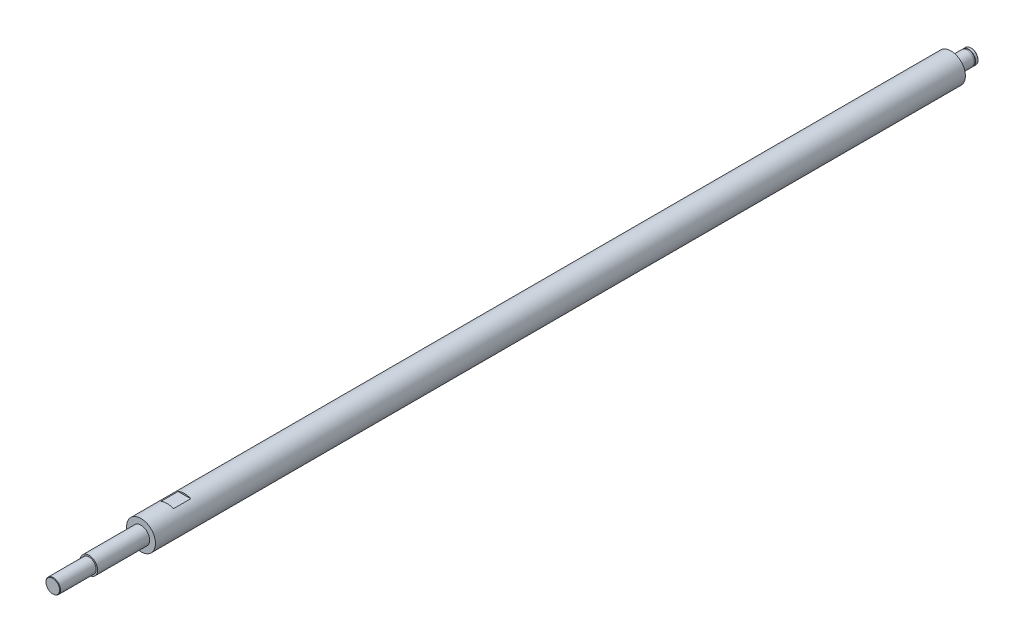
ISO-10303-21;
HEADER;
FILE_DESCRIPTION(('STEP AP214'),'2;1');
FILE_NAME('part.step','',(''),(''),'','','');
FILE_SCHEMA(('AUTOMOTIVE_DESIGN { 1 0 10303 214 1 1 1 1 }'));
ENDSEC;
DATA;
#1=APPLICATION_CONTEXT('core data for automotive mechanical design processes');
#2=APPLICATION_PROTOCOL_DEFINITION('international standard','automotive_design',2000,#1);
#3=PRODUCT_CONTEXT('',#1,'mechanical');
#4=PRODUCT('Part','Part','',(#3));
#5=PRODUCT_RELATED_PRODUCT_CATEGORY('part','',(#4));
#6=PRODUCT_DEFINITION_FORMATION('','',#4);
#7=PRODUCT_DEFINITION_CONTEXT('part definition',#1,'design');
#8=PRODUCT_DEFINITION('design','',#6,#7);
#9=PRODUCT_DEFINITION_SHAPE('','',#8);
#10=(LENGTH_UNIT() NAMED_UNIT(*) SI_UNIT(.MILLI.,.METRE.));
#11=(NAMED_UNIT(*) PLANE_ANGLE_UNIT() SI_UNIT($,.RADIAN.));
#12=(NAMED_UNIT(*) SI_UNIT($,.STERADIAN.) SOLID_ANGLE_UNIT());
#13=UNCERTAINTY_MEASURE_WITH_UNIT(LENGTH_MEASURE(1.E-05),#10,'distance_accuracy_value','');
#14=(GEOMETRIC_REPRESENTATION_CONTEXT(3) GLOBAL_UNCERTAINTY_ASSIGNED_CONTEXT((#13)) GLOBAL_UNIT_ASSIGNED_CONTEXT((#10,
#11,#12)) REPRESENTATION_CONTEXT('',''));
#15=CARTESIAN_POINT('',(0.,0.,0.));
#16=DIRECTION('',(0.,0.,1.));
#17=DIRECTION('',(1.,0.,0.));
#18=AXIS2_PLACEMENT_3D('',#15,#16,#17);
#19=CARTESIAN_POINT('',(0.,0.,610.));
#20=DIRECTION('',(0.,0.,1.));
#21=DIRECTION('',(1.,0.,0.));
#22=AXIS2_PLACEMENT_3D('',#19,#20,#21);
#23=PLANE('',#22);
#24=CARTESIAN_POINT('',(0.,0.,610.));
#25=DIRECTION('',(0.,0.,1.));
#26=DIRECTION('',(1.,0.,0.));
#27=AXIS2_PLACEMENT_3D('',#24,#25,#26);
#28=CIRCLE('',#27,6.);
#29=CARTESIAN_POINT('',(6.,0.,610.));
#30=VERTEX_POINT('',#29);
#31=EDGE_CURVE('E314',#30,#30,#28,.T.);
#32=ORIENTED_EDGE('',*,*,#31,.T.);
#33=EDGE_LOOP('',(#32));
#34=FACE_BOUND('',#33,.T.);
#35=CARTESIAN_POINT('',(0.,0.,610.));
#36=DIRECTION('',(0.,0.,1.));
#37=DIRECTION('',(1.,0.,0.));
#38=AXIS2_PLACEMENT_3D('',#35,#36,#37);
#39=CIRCLE('',#38,5.);
#40=CARTESIAN_POINT('',(5.,0.,610.));
#41=VERTEX_POINT('',#40);
#42=EDGE_CURVE('E310',#41,#41,#39,.T.);
#43=ORIENTED_EDGE('',*,*,#42,.F.);
#44=EDGE_LOOP('',(#43));
#45=FACE_BOUND('',#44,.T.);
#46=ADVANCED_FACE('F17',(#34,#45),#23,.T.);
#47=CARTESIAN_POINT('',(0.,0.,574.));
#48=DIRECTION('',(0.,0.,1.));
#49=DIRECTION('',(1.,0.,0.));
#50=AXIS2_PLACEMENT_3D('',#47,#48,#49);
#51=PLANE('',#50);
#52=CARTESIAN_POINT('',(0.,0.,574.));
#53=DIRECTION('',(0.,0.,1.));
#54=DIRECTION('',(1.,0.,0.));
#55=AXIS2_PLACEMENT_3D('',#52,#53,#54);
#56=CIRCLE('',#55,10.);
#57=CARTESIAN_POINT('',(10.,0.,574.));
#58=VERTEX_POINT('',#57);
#59=EDGE_CURVE('E319',#58,#58,#56,.T.);
#60=ORIENTED_EDGE('',*,*,#59,.T.);
#61=EDGE_LOOP('',(#60));
#62=FACE_BOUND('',#61,.T.);
#63=CARTESIAN_POINT('',(0.,0.,574.));
#64=DIRECTION('',(0.,0.,1.));
#65=DIRECTION('',(1.,0.,0.));
#66=AXIS2_PLACEMENT_3D('',#63,#64,#65);
#67=CIRCLE('',#66,6.);
#68=CARTESIAN_POINT('',(6.,0.,574.));
#69=VERTEX_POINT('',#68);
#70=EDGE_CURVE('E313',#69,#69,#67,.T.);
#71=ORIENTED_EDGE('',*,*,#70,.F.);
#72=EDGE_LOOP('',(#71));
#73=FACE_BOUND('',#72,.T.);
#74=ADVANCED_FACE('F101',(#62,#73),#51,.T.);
#75=CARTESIAN_POINT('',(0.,0.,1.9));
#76=DIRECTION('',(0.,0.,1.));
#77=DIRECTION('',(1.,0.,0.));
#78=AXIS2_PLACEMENT_3D('',#75,#76,#77);
#79=PLANE('',#78);
#80=CARTESIAN_POINT('',(0.,0.,1.9));
#81=DIRECTION('',(0.,0.,1.));
#82=DIRECTION('',(1.,0.,0.));
#83=AXIS2_PLACEMENT_3D('',#80,#81,#82);
#84=CIRCLE('',#83,5.);
#85=CARTESIAN_POINT('',(5.,0.,1.9));
#86=VERTEX_POINT('',#85);
#87=EDGE_CURVE('E334',#86,#86,#84,.T.);
#88=ORIENTED_EDGE('',*,*,#87,.T.);
#89=EDGE_LOOP('',(#88));
#90=FACE_BOUND('',#89,.T.);
#91=CARTESIAN_POINT('',(0.,0.,1.9));
#92=DIRECTION('',(0.,0.,1.));
#93=DIRECTION('',(1.,0.,0.));
#94=AXIS2_PLACEMENT_3D('',#91,#92,#93);
#95=CIRCLE('',#94,4.65);
#96=CARTESIAN_POINT('',(4.65,0.,1.9));
#97=VERTEX_POINT('',#96);
#98=EDGE_CURVE('E328',#97,#97,#95,.T.);
#99=ORIENTED_EDGE('',*,*,#98,.F.);
#100=EDGE_LOOP('',(#99));
#101=FACE_BOUND('',#100,.T.);
#102=ADVANCED_FACE('F107',(#90,#101),#79,.T.);
#103=CARTESIAN_POINT('',(0.,0.,1.9));
#104=DIRECTION('',(0.,0.,-1.));
#105=DIRECTION('',(-1.,0.,0.));
#106=AXIS2_PLACEMENT_3D('',#103,#104,#105);
#107=CYLINDRICAL_SURFACE('',#106,5.);
#108=CARTESIAN_POINT('',(0.,0.,0.300000000000168));
#109=DIRECTION('',(0.,0.,1.));
#110=DIRECTION('',(1.,0.,0.));
#111=AXIS2_PLACEMENT_3D('',#108,#109,#110);
#112=CIRCLE('',#111,5.);
#113=CARTESIAN_POINT('',(5.,0.,0.300000000000168));
#114=VERTEX_POINT('',#113);
#115=EDGE_CURVE('E25',#114,#114,#112,.T.);
#116=ORIENTED_EDGE('',*,*,#115,.T.);
#117=EDGE_LOOP('',(#116));
#118=FACE_BOUND('',#117,.T.);
#119=ORIENTED_EDGE('',*,*,#87,.F.);
#120=EDGE_LOOP('',(#119));
#121=FACE_BOUND('',#120,.T.);
#122=ADVANCED_FACE('F88',(#118,#121),#107,.T.);
#123=CARTESIAN_POINT('',(0.,0.,0.));
#124=DIRECTION('',(0.,0.,1.));
#125=DIRECTION('',(1.,0.,0.));
#126=AXIS2_PLACEMENT_3D('',#123,#124,#125);
#127=PLANE('',#126);
#128=CARTESIAN_POINT('',(0.,0.,0.));
#129=DIRECTION('',(0.,0.,1.));
#130=DIRECTION('',(1.,0.,0.));
#131=AXIS2_PLACEMENT_3D('',#128,#129,#130);
#132=CIRCLE('',#131,4.69999999999982);
#133=CARTESIAN_POINT('',(4.69999999999982,0.,0.));
#134=VERTEX_POINT('',#133);
#135=EDGE_CURVE('E11',#134,#134,#132,.F.);
#136=ORIENTED_EDGE('',*,*,#135,.T.);
#137=EDGE_LOOP('',(#136));
#138=FACE_BOUND('',#137,.T.);
#139=ADVANCED_FACE('F137',(#138),#127,.F.);
#140=CARTESIAN_POINT('',(0.,0.,3.));
#141=DIRECTION('',(0.,0.,-1.));
#142=DIRECTION('',(-1.,0.,0.));
#143=AXIS2_PLACEMENT_3D('',#140,#141,#142);
#144=CYLINDRICAL_SURFACE('',#143,4.65);
#145=CARTESIAN_POINT('',(0.,0.,3.));
#146=DIRECTION('',(0.,0.,1.));
#147=DIRECTION('',(1.,0.,0.));
#148=AXIS2_PLACEMENT_3D('',#145,#146,#147);
#149=CIRCLE('',#148,4.65);
#150=CARTESIAN_POINT('',(4.65,0.,3.));
#151=VERTEX_POINT('',#150);
#152=EDGE_CURVE('E331',#151,#151,#149,.T.);
#153=ORIENTED_EDGE('',*,*,#152,.F.);
#154=EDGE_LOOP('',(#153));
#155=FACE_BOUND('',#154,.T.);
#156=ORIENTED_EDGE('',*,*,#98,.T.);
#157=EDGE_LOOP('',(#156));
#158=FACE_BOUND('',#157,.T.);
#159=ADVANCED_FACE('F130',(#155,#158),#144,.T.);
#160=CARTESIAN_POINT('',(0.,0.,3.));
#161=DIRECTION('',(0.,0.,1.));
#162=DIRECTION('',(1.,0.,0.));
#163=AXIS2_PLACEMENT_3D('',#160,#161,#162);
#164=PLANE('',#163);
#165=CARTESIAN_POINT('',(0.,0.,3.));
#166=DIRECTION('',(0.,0.,1.));
#167=DIRECTION('',(1.,0.,0.));
#168=AXIS2_PLACEMENT_3D('',#165,#166,#167);
#169=CIRCLE('',#168,5.);
#170=CARTESIAN_POINT('',(5.,0.,3.));
#171=VERTEX_POINT('',#170);
#172=EDGE_CURVE('E322',#171,#171,#169,.T.);
#173=ORIENTED_EDGE('',*,*,#172,.F.);
#174=EDGE_LOOP('',(#173));
#175=FACE_BOUND('',#174,.T.);
#176=ORIENTED_EDGE('',*,*,#152,.T.);
#177=EDGE_LOOP('',(#176));
#178=FACE_BOUND('',#177,.T.);
#179=ADVANCED_FACE('F127',(#175,#178),#164,.F.);
#180=CARTESIAN_POINT('',(0.,0.,14.));
#181=DIRECTION('',(0.,0.,-1.));
#182=DIRECTION('',(-1.,0.,0.));
#183=AXIS2_PLACEMENT_3D('',#180,#181,#182);
#184=CYLINDRICAL_SURFACE('',#183,5.);
#185=CARTESIAN_POINT('',(0.,0.,14.));
#186=DIRECTION('',(0.,0.,1.));
#187=DIRECTION('',(1.,0.,0.));
#188=AXIS2_PLACEMENT_3D('',#185,#186,#187);
#189=CIRCLE('',#188,5.);
#190=CARTESIAN_POINT('',(5.,0.,14.));
#191=VERTEX_POINT('',#190);
#192=EDGE_CURVE('E325',#191,#191,#189,.T.);
#193=ORIENTED_EDGE('',*,*,#192,.F.);
#194=EDGE_LOOP('',(#193));
#195=FACE_BOUND('',#194,.T.);
#196=ORIENTED_EDGE('',*,*,#172,.T.);
#197=EDGE_LOOP('',(#196));
#198=FACE_BOUND('',#197,.T.);
#199=ADVANCED_FACE('F123',(#195,#198),#184,.T.);
#200=CARTESIAN_POINT('',(0.,0.,14.));
#201=DIRECTION('',(0.,0.,1.));
#202=DIRECTION('',(1.,0.,0.));
#203=AXIS2_PLACEMENT_3D('',#200,#201,#202);
#204=PLANE('',#203);
#205=CARTESIAN_POINT('',(0.,0.,14.));
#206=DIRECTION('',(0.,0.,1.));
#207=DIRECTION('',(1.,0.,0.));
#208=AXIS2_PLACEMENT_3D('',#205,#206,#207);
#209=CIRCLE('',#208,10.);
#210=CARTESIAN_POINT('',(10.,0.,14.));
#211=VERTEX_POINT('',#210);
#212=EDGE_CURVE('E316',#211,#211,#209,.T.);
#213=ORIENTED_EDGE('',*,*,#212,.F.);
#214=EDGE_LOOP('',(#213));
#215=FACE_BOUND('',#214,.T.);
#216=ORIENTED_EDGE('',*,*,#192,.T.);
#217=EDGE_LOOP('',(#216));
#218=FACE_BOUND('',#217,.T.);
#219=ADVANCED_FACE('F120',(#215,#218),#204,.F.);
#220=CARTESIAN_POINT('',(0.,0.,574.));
#221=DIRECTION('',(0.,0.,-1.));
#222=DIRECTION('',(-1.,0.,0.));
#223=AXIS2_PLACEMENT_3D('',#220,#221,#222);
#224=CYLINDRICAL_SURFACE('',#223,10.);
#225=CARTESIAN_POINT('',(0.,0.,556.));
#226=DIRECTION('',(0.,0.,-1.));
#227=DIRECTION('',(-1.,0.,0.));
#228=AXIS2_PLACEMENT_3D('',#225,#226,#227);
#229=CIRCLE('',#228,10.);
#230=CARTESIAN_POINT('',(-4.35889894354067,9.,556.));
#231=VERTEX_POINT('',#230);
#232=CARTESIAN_POINT('',(4.35889894354067,9.,556.));
#233=VERTEX_POINT('',#232);
#234=EDGE_CURVE('E69',#231,#233,#229,.T.);
#235=ORIENTED_EDGE('',*,*,#234,.F.);
#236=DIRECTION('',(0.,0.,-1.));
#237=VECTOR('',#236,1.);
#238=CARTESIAN_POINT('',(-4.35889894354067,9.,574.));
#239=LINE('',#238,#237);
#240=CARTESIAN_POINT('',(-4.35889894354067,9.,544.));
#241=VERTEX_POINT('',#240);
#242=EDGE_CURVE('E57',#231,#241,#239,.T.);
#243=ORIENTED_EDGE('',*,*,#242,.T.);
#244=CARTESIAN_POINT('',(0.,0.,544.));
#245=DIRECTION('',(0.,0.,1.));
#246=DIRECTION('',(1.,0.,0.));
#247=AXIS2_PLACEMENT_3D('',#244,#245,#246);
#248=CIRCLE('',#247,10.);
#249=CARTESIAN_POINT('',(4.35889894354067,9.,544.));
#250=VERTEX_POINT('',#249);
#251=EDGE_CURVE('E65',#250,#241,#248,.T.);
#252=ORIENTED_EDGE('',*,*,#251,.F.);
#253=DIRECTION('',(0.,0.,-1.));
#254=VECTOR('',#253,1.);
#255=CARTESIAN_POINT('',(4.35889894354067,9.,574.));
#256=LINE('',#255,#254);
#257=EDGE_CURVE('E74',#250,#233,#256,.F.);
#258=ORIENTED_EDGE('',*,*,#257,.T.);
#259=EDGE_LOOP('',(#235,#243,#252,#258));
#260=FACE_BOUND('',#259,.T.);
#261=CARTESIAN_POINT('',(0.,0.,556.));
#262=DIRECTION('',(0.,0.,1.));
#263=DIRECTION('',(1.,0.,0.));
#264=AXIS2_PLACEMENT_3D('',#261,#262,#263);
#265=CIRCLE('',#264,10.);
#266=CARTESIAN_POINT('',(-4.35889894354067,-9.,556.));
#267=VERTEX_POINT('',#266);
#268=CARTESIAN_POINT('',(4.35889894354067,-9.,556.));
#269=VERTEX_POINT('',#268);
#270=EDGE_CURVE('E345',#267,#269,#265,.T.);
#271=ORIENTED_EDGE('',*,*,#270,.T.);
#272=DIRECTION('',(0.,0.,-1.));
#273=VECTOR('',#272,1.);
#274=CARTESIAN_POINT('',(4.35889894354067,-9.,574.));
#275=LINE('',#274,#273);
#276=CARTESIAN_POINT('',(4.35889894354067,-9.,544.));
#277=VERTEX_POINT('',#276);
#278=EDGE_CURVE('E77',#269,#277,#275,.T.);
#279=ORIENTED_EDGE('',*,*,#278,.T.);
#280=CARTESIAN_POINT('',(0.,0.,544.));
#281=DIRECTION('',(0.,0.,-1.));
#282=DIRECTION('',(-1.,0.,0.));
#283=AXIS2_PLACEMENT_3D('',#280,#281,#282);
#284=CIRCLE('',#283,10.);
#285=CARTESIAN_POINT('',(-4.35889894354067,-9.,544.));
#286=VERTEX_POINT('',#285);
#287=EDGE_CURVE('E342',#277,#286,#284,.T.);
#288=ORIENTED_EDGE('',*,*,#287,.T.);
#289=DIRECTION('',(0.,0.,-1.));
#290=VECTOR('',#289,1.);
#291=CARTESIAN_POINT('',(-4.35889894354067,-9.,574.));
#292=LINE('',#291,#290);
#293=EDGE_CURVE('E339',#286,#267,#292,.F.);
#294=ORIENTED_EDGE('',*,*,#293,.T.);
#295=EDGE_LOOP('',(#271,#279,#288,#294));
#296=FACE_BOUND('',#295,.T.);
#297=ORIENTED_EDGE('',*,*,#59,.F.);
#298=EDGE_LOOP('',(#297));
#299=FACE_BOUND('',#298,.T.);
#300=ORIENTED_EDGE('',*,*,#212,.T.);
#301=EDGE_LOOP('',(#300));
#302=FACE_BOUND('',#301,.T.);
#303=ADVANCED_FACE('F72',(#260,#296,#299,#302),#224,.T.);
#304=CARTESIAN_POINT('',(0.,0.,610.));
#305=DIRECTION('',(0.,0.,-1.));
#306=DIRECTION('',(-1.,0.,0.));
#307=AXIS2_PLACEMENT_3D('',#304,#305,#306);
#308=CYLINDRICAL_SURFACE('',#307,6.);
#309=ORIENTED_EDGE('',*,*,#31,.F.);
#310=EDGE_LOOP('',(#309));
#311=FACE_BOUND('',#310,.T.);
#312=ORIENTED_EDGE('',*,*,#70,.T.);
#313=EDGE_LOOP('',(#312));
#314=FACE_BOUND('',#313,.T.);
#315=ADVANCED_FACE('F116',(#311,#314),#308,.T.);
#316=CARTESIAN_POINT('',(0.,0.,635.));
#317=DIRECTION('',(0.,0.,-1.));
#318=DIRECTION('',(-1.,0.,0.));
#319=AXIS2_PLACEMENT_3D('',#316,#317,#318);
#320=CYLINDRICAL_SURFACE('',#319,5.);
#321=CARTESIAN_POINT('',(0.,0.,634.7));
#322=DIRECTION('',(0.,0.,1.));
#323=DIRECTION('',(1.,0.,0.));
#324=AXIS2_PLACEMENT_3D('',#321,#322,#323);
#325=CIRCLE('',#324,5.);
#326=CARTESIAN_POINT('',(5.,0.,634.7));
#327=VERTEX_POINT('',#326);
#328=EDGE_CURVE('E83',#327,#327,#325,.F.);
#329=ORIENTED_EDGE('',*,*,#328,.T.);
#330=EDGE_LOOP('',(#329));
#331=FACE_BOUND('',#330,.T.);
#332=ORIENTED_EDGE('',*,*,#42,.T.);
#333=EDGE_LOOP('',(#332));
#334=FACE_BOUND('',#333,.T.);
#335=ADVANCED_FACE('F114',(#331,#334),#320,.T.);
#336=CARTESIAN_POINT('',(0.,0.,635.));
#337=DIRECTION('',(0.,0.,1.));
#338=DIRECTION('',(1.,0.,0.));
#339=AXIS2_PLACEMENT_3D('',#336,#337,#338);
#340=PLANE('',#339);
#341=CARTESIAN_POINT('',(0.,0.,635.));
#342=DIRECTION('',(0.,0.,1.));
#343=DIRECTION('',(1.,0.,0.));
#344=AXIS2_PLACEMENT_3D('',#341,#342,#343);
#345=CIRCLE('',#344,4.7);
#346=CARTESIAN_POINT('',(4.7,0.,635.));
#347=VERTEX_POINT('',#346);
#348=EDGE_CURVE('E64',#347,#347,#345,.T.);
#349=ORIENTED_EDGE('',*,*,#348,.T.);
#350=EDGE_LOOP('',(#349));
#351=FACE_BOUND('',#350,.T.);
#352=ADVANCED_FACE('F194',(#351),#340,.T.);
#353=CARTESIAN_POINT('',(-20.,-21.,556.));
#354=DIRECTION('',(0.,0.,1.));
#355=DIRECTION('',(1.,0.,0.));
#356=AXIS2_PLACEMENT_3D('',#353,#354,#355);
#357=PLANE('',#356);
#358=DIRECTION('',(1.,0.,0.));
#359=VECTOR('',#358,1.);
#360=CARTESIAN_POINT('',(-20.,-9.,556.));
#361=LINE('',#360,#359);
#362=EDGE_CURVE('E40',#267,#269,#361,.T.);
#363=ORIENTED_EDGE('',*,*,#362,.T.);
#364=ORIENTED_EDGE('',*,*,#270,.F.);
#365=EDGE_LOOP('',(#363,#364));
#366=FACE_BOUND('',#365,.T.);
#367=ADVANCED_FACE('F202',(#366),#357,.F.);
#368=CARTESIAN_POINT('',(-20.,-21.,544.));
#369=DIRECTION('',(0.,0.,-1.));
#370=DIRECTION('',(-1.,0.,0.));
#371=AXIS2_PLACEMENT_3D('',#368,#369,#370);
#372=PLANE('',#371);
#373=DIRECTION('',(-1.,0.,0.));
#374=VECTOR('',#373,1.);
#375=CARTESIAN_POINT('',(-20.,-9.,544.));
#376=LINE('',#375,#374);
#377=EDGE_CURVE('E304',#277,#286,#376,.T.);
#378=ORIENTED_EDGE('',*,*,#377,.T.);
#379=ORIENTED_EDGE('',*,*,#287,.F.);
#380=EDGE_LOOP('',(#378,#379));
#381=FACE_BOUND('',#380,.T.);
#382=ADVANCED_FACE('F210',(#381),#372,.F.);
#383=CARTESIAN_POINT('',(0.,-9.,0.));
#384=DIRECTION('',(0.,1.,0.));
#385=DIRECTION('',(0.,0.,1.));
#386=AXIS2_PLACEMENT_3D('',#383,#384,#385);
#387=PLANE('',#386);
#388=ORIENTED_EDGE('',*,*,#362,.F.);
#389=ORIENTED_EDGE('',*,*,#293,.F.);
#390=ORIENTED_EDGE('',*,*,#377,.F.);
#391=ORIENTED_EDGE('',*,*,#278,.F.);
#392=EDGE_LOOP('',(#388,#389,#390,#391));
#393=FACE_BOUND('',#392,.T.);
#394=ADVANCED_FACE('F219',(#393),#387,.F.);
#395=CARTESIAN_POINT('',(-20.,21.,544.));
#396=DIRECTION('',(0.,0.,1.));
#397=DIRECTION('',(1.,0.,0.));
#398=AXIS2_PLACEMENT_3D('',#395,#396,#397);
#399=PLANE('',#398);
#400=ORIENTED_EDGE('',*,*,#251,.T.);
#401=DIRECTION('',(-1.,0.,0.));
#402=VECTOR('',#401,1.);
#403=CARTESIAN_POINT('',(-20.,9.,544.));
#404=LINE('',#403,#402);
#405=EDGE_CURVE('E60',#250,#241,#404,.T.);
#406=ORIENTED_EDGE('',*,*,#405,.F.);
#407=EDGE_LOOP('',(#400,#406));
#408=FACE_BOUND('',#407,.T.);
#409=ADVANCED_FACE('F228',(#408),#399,.T.);
#410=CARTESIAN_POINT('',(-20.,21.,556.));
#411=DIRECTION('',(0.,0.,-1.));
#412=DIRECTION('',(-1.,0.,0.));
#413=AXIS2_PLACEMENT_3D('',#410,#411,#412);
#414=PLANE('',#413);
#415=ORIENTED_EDGE('',*,*,#234,.T.);
#416=DIRECTION('',(1.,0.,0.));
#417=VECTOR('',#416,1.);
#418=CARTESIAN_POINT('',(-20.,9.,556.));
#419=LINE('',#418,#417);
#420=EDGE_CURVE('E32',#231,#233,#419,.T.);
#421=ORIENTED_EDGE('',*,*,#420,.F.);
#422=EDGE_LOOP('',(#415,#421));
#423=FACE_BOUND('',#422,.T.);
#424=ADVANCED_FACE('F68',(#423),#414,.T.);
#425=CARTESIAN_POINT('',(0.,9.,0.));
#426=DIRECTION('',(0.,-1.,0.));
#427=DIRECTION('',(0.,0.,1.));
#428=AXIS2_PLACEMENT_3D('',#425,#426,#427);
#429=PLANE('',#428);
#430=ORIENTED_EDGE('',*,*,#420,.T.);
#431=ORIENTED_EDGE('',*,*,#257,.F.);
#432=ORIENTED_EDGE('',*,*,#405,.T.);
#433=ORIENTED_EDGE('',*,*,#242,.F.);
#434=EDGE_LOOP('',(#430,#431,#432,#433));
#435=FACE_BOUND('',#434,.T.);
#436=ADVANCED_FACE('F58',(#435),#429,.F.);
#437=CARTESIAN_POINT('',(0.,0.,635.));
#438=DIRECTION('',(0.,0.,-1.));
#439=DIRECTION('',(-1.,0.,0.));
#440=AXIS2_PLACEMENT_3D('',#437,#438,#439);
#441=CONICAL_SURFACE('',#440,4.7,0.785398163397441);
#442=ORIENTED_EDGE('',*,*,#328,.F.);
#443=EDGE_LOOP('',(#442));
#444=FACE_BOUND('',#443,.T.);
#445=ORIENTED_EDGE('',*,*,#348,.F.);
#446=EDGE_LOOP('',(#445));
#447=FACE_BOUND('',#446,.T.);
#448=ADVANCED_FACE('F92',(#444,#447),#441,.T.);
#449=CARTESIAN_POINT('',(0.,0.,0.300000000000168));
#450=DIRECTION('',(0.,0.,1.));
#451=DIRECTION('',(1.,0.,0.));
#452=AXIS2_PLACEMENT_3D('',#449,#450,#451);
#453=CONICAL_SURFACE('',#452,5.,0.785398163397477);
#454=ORIENTED_EDGE('',*,*,#135,.F.);
#455=EDGE_LOOP('',(#454));
#456=FACE_BOUND('',#455,.T.);
#457=ORIENTED_EDGE('',*,*,#115,.F.);
#458=EDGE_LOOP('',(#457));
#459=FACE_BOUND('',#458,.T.);
#460=ADVANCED_FACE('F19',(#456,#459),#453,.T.);
#461=CLOSED_SHELL('',(#46,#74,#102,#122,#139,#159,#179,#199,#219,#303,#315,#335,#352,#367,#382,
#394,#409,#424,#436,#448,#460));
#462=MANIFOLD_SOLID_BREP('B1',#461);
#463=ADVANCED_BREP_SHAPE_REPRESENTATION('',(#18,#462),#14);
#464=SHAPE_DEFINITION_REPRESENTATION(#9,#463);
ENDSEC;
END-ISO-10303-21;
